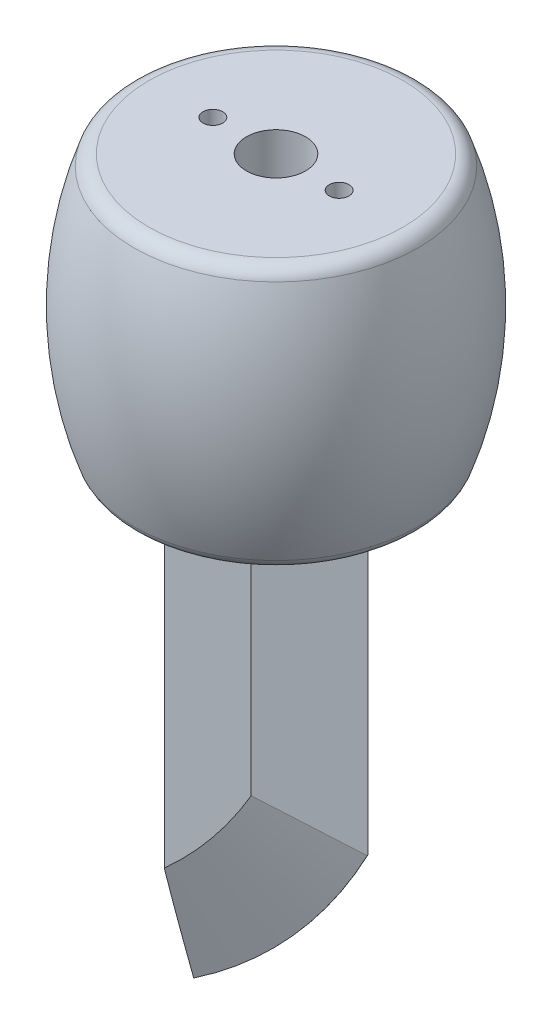
ISO-10303-21;
HEADER;
FILE_DESCRIPTION(('STEP AP214'),'2;1');
FILE_NAME('part.step','',(''),(''),'','','');
FILE_SCHEMA(('AUTOMOTIVE_DESIGN { 1 0 10303 214 1 1 1 1 }'));
ENDSEC;
DATA;
#1=APPLICATION_CONTEXT('core data for automotive mechanical design processes');
#2=APPLICATION_PROTOCOL_DEFINITION('international standard','automotive_design',2000,#1);
#3=PRODUCT_CONTEXT('',#1,'mechanical');
#4=PRODUCT('Part','Part','',(#3));
#5=PRODUCT_RELATED_PRODUCT_CATEGORY('part','',(#4));
#6=PRODUCT_DEFINITION_FORMATION('','',#4);
#7=PRODUCT_DEFINITION_CONTEXT('part definition',#1,'design');
#8=PRODUCT_DEFINITION('design','',#6,#7);
#9=PRODUCT_DEFINITION_SHAPE('','',#8);
#10=(LENGTH_UNIT() NAMED_UNIT(*) SI_UNIT(.MILLI.,.METRE.));
#11=(NAMED_UNIT(*) PLANE_ANGLE_UNIT() SI_UNIT($,.RADIAN.));
#12=(NAMED_UNIT(*) SI_UNIT($,.STERADIAN.) SOLID_ANGLE_UNIT());
#13=UNCERTAINTY_MEASURE_WITH_UNIT(LENGTH_MEASURE(1.E-05),#10,'distance_accuracy_value','');
#14=(GEOMETRIC_REPRESENTATION_CONTEXT(3) GLOBAL_UNCERTAINTY_ASSIGNED_CONTEXT((#13)) GLOBAL_UNIT_ASSIGNED_CONTEXT((#10,
#11,#12)) REPRESENTATION_CONTEXT('',''));
#15=CARTESIAN_POINT('',(0.,0.,0.));
#16=DIRECTION('',(0.,0.,1.));
#17=DIRECTION('',(1.,0.,0.));
#18=AXIS2_PLACEMENT_3D('',#15,#16,#17);
#19=CARTESIAN_POINT('',(180.83032118404,79.2235623394899,0.));
#20=DIRECTION('',(0.,-1.,0.));
#21=DIRECTION('',(1.,0.,0.));
#22=AXIS2_PLACEMENT_3D('',#19,#20,#21);
#23=PLANE('',#22);
#24=DIRECTION('',(0.94667744010841,0.,-0.322182905179321));
#25=VECTOR('',#24,1.);
#26=CARTESIAN_POINT('',(181.60603529775,79.2235623394899,4.7625));
#27=LINE('',#26,#25);
#28=CARTESIAN_POINT('',(181.60603529775,79.2235623394899,4.7625));
#29=VERTEX_POINT('',#28);
#30=CARTESIAN_POINT('',(195.599798579532,79.2235623394899,0.));
#31=VERTEX_POINT('',#30);
#32=EDGE_CURVE('E48',#29,#31,#27,.T.);
#33=ORIENTED_EDGE('',*,*,#32,.T.);
#34=DIRECTION('',(-0.94667744010841,0.,-0.322182905179321));
#35=VECTOR('',#34,1.);
#36=CARTESIAN_POINT('',(195.599798579532,79.2235623394899,0.));
#37=LINE('',#36,#35);
#38=CARTESIAN_POINT('',(181.60603529775,79.2235623394899,-4.7625));
#39=VERTEX_POINT('',#38);
#40=EDGE_CURVE('E106',#31,#39,#37,.T.);
#41=ORIENTED_EDGE('',*,*,#40,.T.);
#42=DIRECTION('',(-1.,0.,0.));
#43=VECTOR('',#42,1.);
#44=CARTESIAN_POINT('',(167.612272015968,79.2235623394899,-4.7625));
#45=LINE('',#44,#43);
#46=CARTESIAN_POINT('',(167.612272015968,79.2235623394899,-4.7625));
#47=VERTEX_POINT('',#46);
#48=EDGE_CURVE('E56',#39,#47,#45,.T.);
#49=ORIENTED_EDGE('',*,*,#48,.T.);
#50=DIRECTION('',(0.,0.,1.));
#51=VECTOR('',#50,1.);
#52=CARTESIAN_POINT('',(167.612272015968,79.2235623394899,-4.7625));
#53=LINE('',#52,#51);
#54=CARTESIAN_POINT('',(167.612272015968,79.2235623394899,4.7625));
#55=VERTEX_POINT('',#54);
#56=EDGE_CURVE('E168',#47,#55,#53,.T.);
#57=ORIENTED_EDGE('',*,*,#56,.T.);
#58=DIRECTION('',(-1.,0.,0.));
#59=VECTOR('',#58,1.);
#60=CARTESIAN_POINT('',(167.612272015968,79.2235623394899,4.7625));
#61=LINE('',#60,#59);
#62=EDGE_CURVE('E107',#29,#55,#61,.T.);
#63=ORIENTED_EDGE('',*,*,#62,.F.);
#64=EDGE_LOOP('',(#33,#41,#49,#57,#63));
#65=FACE_BOUND('',#64,.T.);
#66=CARTESIAN_POINT('',(180.83032118404,79.2235623394899,0.));
#67=DIRECTION('',(0.,1.,0.));
#68=DIRECTION('',(-1.,0.,0.));
#69=AXIS2_PLACEMENT_3D('',#66,#67,#68);
#70=CIRCLE('',#69,20.450072340401);
#71=CARTESIAN_POINT('',(160.380248843639,79.2235623394899,0.));
#72=VERTEX_POINT('',#71);
#73=EDGE_CURVE('E11',#72,#72,#70,.T.);
#74=ORIENTED_EDGE('',*,*,#73,.F.);
#75=EDGE_LOOP('',(#74));
#76=FACE_BOUND('',#75,.T.);
#77=ADVANCED_FACE('F33',(#65,#76),#23,.T.);
#78=CARTESIAN_POINT('',(180.83032118404,81.7635623394899,0.));
#79=DIRECTION('',(0.,1.,0.));
#80=DIRECTION('',(-1.,0.,0.));
#81=AXIS2_PLACEMENT_3D('',#78,#79,#80);
#82=TOROIDAL_SURFACE('',#81,20.450072340401,2.54);
#83=ORIENTED_EDGE('',*,*,#73,.T.);
#84=EDGE_LOOP('',(#83));
#85=FACE_BOUND('',#84,.T.);
#86=CARTESIAN_POINT('',(180.83032118404,80.9274838250168,0.));
#87=DIRECTION('',(0.,1.,0.));
#88=DIRECTION('',(-1.,0.,0.));
#89=AXIS2_PLACEMENT_3D('',#86,#87,#88);
#90=CIRCLE('',#89,22.8485244907756);
#91=CARTESIAN_POINT('',(157.981796693264,80.9274838250168,0.));
#92=VERTEX_POINT('',#91);
#93=EDGE_CURVE('E41',#92,#92,#90,.T.);
#94=ORIENTED_EDGE('',*,*,#93,.F.);
#95=EDGE_LOOP('',(#94));
#96=FACE_BOUND('',#95,.T.);
#97=ADVANCED_FACE('F193',(#85,#96),#82,.T.);
#98=CARTESIAN_POINT('',(180.83032118404,100.343549653628,0.));
#99=DIRECTION('',(0.,1.,0.));
#100=DIRECTION('',(-1.,0.,0.));
#101=AXIS2_PLACEMENT_3D('',#98,#99,#100);
#102=DEGENERATE_TOROIDAL_SURFACE('',#101,32.850197617633,58.985856412963,.F.);
#103=ORIENTED_EDGE('',*,*,#93,.T.);
#104=EDGE_LOOP('',(#103));
#105=FACE_BOUND('',#104,.T.);
#106=CARTESIAN_POINT('',(180.83032118404,119.759615482239,0.));
#107=DIRECTION('',(0.,1.,0.));
#108=DIRECTION('',(-1.,0.,0.));
#109=AXIS2_PLACEMENT_3D('',#106,#107,#108);
#110=CIRCLE('',#109,22.8485244907756);
#111=CARTESIAN_POINT('',(157.981796693264,119.759615482239,0.));
#112=VERTEX_POINT('',#111);
#113=EDGE_CURVE('E184',#112,#112,#110,.T.);
#114=ORIENTED_EDGE('',*,*,#113,.F.);
#115=EDGE_LOOP('',(#114));
#116=FACE_BOUND('',#115,.T.);
#117=ADVANCED_FACE('F190',(#105,#116),#102,.F.);
#118=CARTESIAN_POINT('',(180.83032118404,118.923536967766,0.));
#119=DIRECTION('',(0.,1.,0.));
#120=DIRECTION('',(-1.,0.,0.));
#121=AXIS2_PLACEMENT_3D('',#118,#119,#120);
#122=TOROIDAL_SURFACE('',#121,20.450072340401,2.54);
#123=ORIENTED_EDGE('',*,*,#113,.T.);
#124=EDGE_LOOP('',(#123));
#125=FACE_BOUND('',#124,.T.);
#126=CARTESIAN_POINT('',(180.83032118404,121.463536967766,0.));
#127=DIRECTION('',(0.,1.,0.));
#128=DIRECTION('',(-1.,0.,0.));
#129=AXIS2_PLACEMENT_3D('',#126,#127,#128);
#130=CIRCLE('',#129,20.450072340401);
#131=CARTESIAN_POINT('',(160.380248843639,121.463536967766,0.));
#132=VERTEX_POINT('',#131);
#133=EDGE_CURVE('E181',#132,#132,#130,.T.);
#134=ORIENTED_EDGE('',*,*,#133,.F.);
#135=EDGE_LOOP('',(#134));
#136=FACE_BOUND('',#135,.T.);
#137=ADVANCED_FACE('F200',(#125,#136),#122,.T.);
#138=CARTESIAN_POINT('',(164.95532118404,121.463536967766,0.));
#139=DIRECTION('',(0.,1.,0.));
#140=DIRECTION('',(-1.,0.,0.));
#141=AXIS2_PLACEMENT_3D('',#138,#139,#140);
#142=PLANE('',#141);
#143=CARTESIAN_POINT('',(190.99032118404,121.463536967766,0.));
#144=DIRECTION('',(0.,1.,0.));
#145=DIRECTION('',(-1.,0.,0.));
#146=AXIS2_PLACEMENT_3D('',#143,#144,#145);
#147=CIRCLE('',#146,1.58749999999999);
#148=CARTESIAN_POINT('',(189.40282118404,121.463536967766,0.));
#149=VERTEX_POINT('',#148);
#150=EDGE_CURVE('E250',#149,#149,#147,.T.);
#151=ORIENTED_EDGE('',*,*,#150,.F.);
#152=EDGE_LOOP('',(#151));
#153=FACE_BOUND('',#152,.T.);
#154=CARTESIAN_POINT('',(170.67032118404,121.463536967766,0.));
#155=DIRECTION('',(0.,1.,0.));
#156=DIRECTION('',(-1.,0.,0.));
#157=AXIS2_PLACEMENT_3D('',#154,#155,#156);
#158=CIRCLE('',#157,1.58749999999999);
#159=CARTESIAN_POINT('',(169.08282118404,121.463536967766,0.));
#160=VERTEX_POINT('',#159);
#161=EDGE_CURVE('E151',#160,#160,#158,.T.);
#162=ORIENTED_EDGE('',*,*,#161,.F.);
#163=EDGE_LOOP('',(#162));
#164=FACE_BOUND('',#163,.T.);
#165=ORIENTED_EDGE('',*,*,#133,.T.);
#166=EDGE_LOOP('',(#165));
#167=FACE_BOUND('',#166,.T.);
#168=CARTESIAN_POINT('',(180.83032118404,121.463536967766,0.));
#169=DIRECTION('',(0.,-1.,0.));
#170=DIRECTION('',(0.,0.,-1.));
#171=AXIS2_PLACEMENT_3D('',#168,#169,#170);
#172=CIRCLE('',#171,4.76250000000001);
#173=CARTESIAN_POINT('',(180.83032118404,121.463536967766,-4.76250000000001));
#174=VERTEX_POINT('',#173);
#175=EDGE_CURVE('E36',#174,#174,#172,.F.);
#176=ORIENTED_EDGE('',*,*,#175,.F.);
#177=EDGE_LOOP('',(#176));
#178=FACE_BOUND('',#177,.T.);
#179=ADVANCED_FACE('F205',(#153,#164,#167,#178),#142,.T.);
#180=CARTESIAN_POINT('',(119.528704548027,71.367250197041,-4.7625));
#181=DIRECTION('',(0.,0.,1.));
#182=DIRECTION('',(1.,0.,0.));
#183=AXIS2_PLACEMENT_3D('',#180,#181,#182);
#184=CYLINDRICAL_SURFACE('',#183,86.05413331811);
#185=CARTESIAN_POINT('',(119.528704548027,71.367250197041,-0.0230487278248571));
#186=DIRECTION('',(0.,0.,-1.));
#187=DIRECTION('',(-1.,0.,0.));
#188=AXIS2_PLACEMENT_3D('',#185,#186,#187);
#189=CIRCLE('',#188,86.05413331811);
#190=CARTESIAN_POINT('',(195.532073972472,31.0088347516532,-0.0230487278248597));
#191=VERTEX_POINT('',#190);
#192=CARTESIAN_POINT('',(167.612272015979,-1.66035614954478E-11,-0.0230487278181186));
#193=VERTEX_POINT('',#192);
#194=EDGE_CURVE('E379',#191,#193,#189,.T.);
#195=ORIENTED_EDGE('',*,*,#194,.F.);
#196=CARTESIAN_POINT('',(119.528704548027,71.367250197041,-25.8892892519261));
#197=DIRECTION('',(0.322182905179321,0.,-0.94667744010841));
#198=DIRECTION('',(0.94667744010841,0.,0.322182905179321));
#199=AXIS2_PLACEMENT_3D('',#196,#197,#198);
#200=ELLIPSE('',#199,90.9012190131576,86.05413331811);
#201=CARTESIAN_POINT('',(195.599798579532,31.136633572622,0.));
#202=VERTEX_POINT('',#201);
#203=EDGE_CURVE('E156',#191,#202,#200,.F.);
#204=ORIENTED_EDGE('',*,*,#203,.T.);
#205=CARTESIAN_POINT('',(119.528704548027,71.367250197041,25.8892892519261));
#206=DIRECTION('',(0.322182905179321,0.,0.94667744010841));
#207=DIRECTION('',(-0.94667744010841,0.,0.322182905179321));
#208=AXIS2_PLACEMENT_3D('',#205,#206,#207);
#209=ELLIPSE('',#208,90.9012190131576,86.05413331811);
#210=CARTESIAN_POINT('',(195.532073972472,31.0088347516532,0.0230487278248524));
#211=VERTEX_POINT('',#210);
#212=EDGE_CURVE('E97',#202,#211,#209,.F.);
#213=ORIENTED_EDGE('',*,*,#212,.T.);
#214=CARTESIAN_POINT('',(119.528704548027,71.367250197041,0.0230487278248571));
#215=DIRECTION('',(0.,0.,-1.));
#216=DIRECTION('',(-1.,0.,0.));
#217=AXIS2_PLACEMENT_3D('',#214,#215,#216);
#218=CIRCLE('',#217,86.05413331811);
#219=CARTESIAN_POINT('',(167.612272015968,0.,0.0230487278248493));
#220=VERTEX_POINT('',#219);
#221=EDGE_CURVE('E131',#220,#211,#218,.F.);
#222=ORIENTED_EDGE('',*,*,#221,.F.);
#223=DIRECTION('',(0.,0.,1.));
#224=VECTOR('',#223,1.);
#225=CARTESIAN_POINT('',(167.612272015968,0.,-4.7625));
#226=LINE('',#225,#224);
#227=EDGE_CURVE('E174',#193,#220,#226,.T.);
#228=ORIENTED_EDGE('',*,*,#227,.F.);
#229=EDGE_LOOP('',(#195,#204,#213,#222,#228));
#230=FACE_BOUND('',#229,.T.);
#231=ADVANCED_FACE('F209',(#230),#184,.T.);
#232=CARTESIAN_POINT('',(167.612272015968,79.2235623394899,-4.7625));
#233=DIRECTION('',(-1.,0.,0.));
#234=DIRECTION('',(0.,0.,1.));
#235=AXIS2_PLACEMENT_3D('',#232,#233,#234);
#236=PLANE('',#235);
#237=CARTESIAN_POINT('',(167.612272015968,0.,-0.023048727824859));
#238=CARTESIAN_POINT('',(167.612272015968,0.735041511566373,-0.228469081930001));
#239=CARTESIAN_POINT('',(167.612272015968,1.47030973892283,-0.433079435122302));
#240=CARTESIAN_POINT('',(167.612272015968,2.94133000814649,-0.840553607666766));
#241=CARTESIAN_POINT('',(167.612272015968,3.67708205006022,-1.04341742685089));
#242=CARTESIAN_POINT('',(167.612272015968,5.14910027267577,-1.44727198249762));
#243=CARTESIAN_POINT('',(167.612272015968,5.88536645343539,-1.64826271874958));
#244=CARTESIAN_POINT('',(167.612272015968,7.35844591053276,-2.04823011905868));
#245=CARTESIAN_POINT('',(167.612272015968,8.09525918694256,-2.24720678285058));
#246=CARTESIAN_POINT('',(167.612272015968,9.56946804832132,-2.64299219060918));
#247=CARTESIAN_POINT('',(167.612272015968,10.3068636333802,-2.83980093424097));
#248=CARTESIAN_POINT('',(167.612272015968,11.7822740679159,-3.23108477765463));
#249=CARTESIAN_POINT('',(167.612272015968,12.5202889175051,-3.42555987701293));
#250=CARTESIAN_POINT('',(167.612272015968,14.7357987584653,-4.00532235629713));
#251=CARTESIAN_POINT('',(167.612272015968,16.214285743438,-4.38681959787286));
#252=CARTESIAN_POINT('',(167.612272015968,17.6942617939415,-4.7625));
#253=B_SPLINE_CURVE_WITH_KNOTS('',3,(#237,#238,#239,#240,#241,#242,#243,#244,#245,#246,#247,
#248,#249,#250,#251,#252),.UNSPECIFIED.,.F.,.F.,(4,2,2,2,2,2,2,4),(0.,2.28961831989026,
4.5792368600707,6.8688556577543,9.15847475698481,11.4480942099406,13.7377140784792,
18.3184241538408),.UNSPECIFIED.);
#254=CARTESIAN_POINT('',(167.612272015968,17.6942617939415,-4.76250000000001));
#255=VERTEX_POINT('',#254);
#256=EDGE_CURVE('E160',#193,#255,#253,.T.);
#257=ORIENTED_EDGE('',*,*,#256,.F.);
#258=ORIENTED_EDGE('',*,*,#227,.T.);
#259=CARTESIAN_POINT('',(167.612272015968,17.6942617939415,4.7625));
#260=CARTESIAN_POINT('',(167.612272015968,16.214793416776,4.38694848982877));
#261=CARTESIAN_POINT('',(167.612272015968,14.7368130857553,4.00558409642277));
#262=CARTESIAN_POINT('',(167.612272015968,12.5218291240936,3.42596477282377));
#263=CARTESIAN_POINT('',(167.612272015968,11.7838343471748,3.23149677996961));
#264=CARTESIAN_POINT('',(167.612272015968,10.3084640587215,2.8402271555123));
#265=CARTESIAN_POINT('',(167.612272015968,9.5710885470683,2.64342552435626));
#266=CARTESIAN_POINT('',(167.612272015968,8.09691983320349,2.24765434499988));
#267=CARTESIAN_POINT('',(167.612272015968,7.36012663089694,2.0486847971529));
#268=CARTESIAN_POINT('',(167.612272015968,5.88708732312565,1.64873162892874));
#269=CARTESIAN_POINT('',(167.612272015968,5.15084121758494,1.44774800883127));
#270=CARTESIAN_POINT('',(167.612272015968,3.67855131766373,1.04382213372675));
#271=CARTESIAN_POINT('',(167.612272015968,2.94250774106541,0.840879085163417));
#272=CARTESIAN_POINT('',(167.612272015968,1.47090047527344,0.43324382325182));
#273=CARTESIAN_POINT('',(167.612272015968,0.735336788877236,0.228551599803369));
#274=CARTESIAN_POINT('',(167.612272015968,0.,0.0230487278248558));
#275=B_SPLINE_CURVE_WITH_KNOTS('',3,(#259,#260,#261,#262,#263,#264,#265,#266,#267,#268,#269,
#270,#271,#272,#273,#274),.UNSPECIFIED.,.F.,.F.,(4,2,2,2,2,2,2,4),(0.,4.57913876955457,
6.86869497527049,9.15825074232698,11.4478061361969,13.7373612120997,16.0278860698116,
18.318424162547),.UNSPECIFIED.);
#276=CARTESIAN_POINT('',(167.612272015968,17.6942617939415,4.7625));
#277=VERTEX_POINT('',#276);
#278=EDGE_CURVE('E124',#277,#220,#275,.T.);
#279=ORIENTED_EDGE('',*,*,#278,.F.);
#280=DIRECTION('',(0.,-1.,0.));
#281=VECTOR('',#280,1.);
#282=CARTESIAN_POINT('',(167.612272015968,79.2235623394899,4.7625));
#283=LINE('',#282,#281);
#284=EDGE_CURVE('E166',#55,#277,#283,.T.);
#285=ORIENTED_EDGE('',*,*,#284,.F.);
#286=ORIENTED_EDGE('',*,*,#56,.F.);
#287=DIRECTION('',(0.,-1.,0.));
#288=VECTOR('',#287,1.);
#289=CARTESIAN_POINT('',(167.612272015968,79.2235623394899,-4.7625));
#290=LINE('',#289,#288);
#291=EDGE_CURVE('E165',#47,#255,#290,.T.);
#292=ORIENTED_EDGE('',*,*,#291,.T.);
#293=EDGE_LOOP('',(#257,#258,#279,#285,#286,#292));
#294=FACE_BOUND('',#293,.T.);
#295=ADVANCED_FACE('F133',(#294),#236,.T.);
#296=CARTESIAN_POINT('',(119.528704548027,71.367250197041,-4.7625));
#297=DIRECTION('',(0.,0.,1.));
#298=DIRECTION('',(1.,0.,0.));
#299=AXIS2_PLACEMENT_3D('',#296,#297,#298);
#300=PLANE('',#299);
#301=DIRECTION('',(0.,1.,0.));
#302=VECTOR('',#301,1.);
#303=CARTESIAN_POINT('',(181.60603529775,9.98185815277274,-4.7625));
#304=LINE('',#303,#302);
#305=CARTESIAN_POINT('',(181.60603529775,34.7718385781949,-4.7625));
#306=VERTEX_POINT('',#305);
#307=EDGE_CURVE('E102',#306,#39,#304,.T.);
#308=ORIENTED_EDGE('',*,*,#307,.F.);
#309=CARTESIAN_POINT('',(119.528704548027,71.367250197041,-4.76250000000001));
#310=DIRECTION('',(0.,0.,-1.));
#311=DIRECTION('',(-1.,0.,0.));
#312=AXIS2_PLACEMENT_3D('',#309,#310,#311);
#313=CIRCLE('',#312,72.0612180341358);
#314=EDGE_CURVE('E117',#306,#255,#313,.T.);
#315=ORIENTED_EDGE('',*,*,#314,.T.);
#316=ORIENTED_EDGE('',*,*,#291,.F.);
#317=ORIENTED_EDGE('',*,*,#48,.F.);
#318=EDGE_LOOP('',(#308,#315,#316,#317));
#319=FACE_BOUND('',#318,.T.);
#320=ADVANCED_FACE('F164',(#319),#300,.F.);
#321=CARTESIAN_POINT('',(119.528704548027,71.367250197041,4.7625));
#322=DIRECTION('',(0.,0.,1.));
#323=DIRECTION('',(1.,0.,0.));
#324=AXIS2_PLACEMENT_3D('',#321,#322,#323);
#325=PLANE('',#324);
#326=CARTESIAN_POINT('',(119.528704548027,71.367250197041,4.7625));
#327=DIRECTION('',(0.,0.,-1.));
#328=DIRECTION('',(-1.,0.,0.));
#329=AXIS2_PLACEMENT_3D('',#326,#327,#328);
#330=CIRCLE('',#329,72.0612180341358);
#331=CARTESIAN_POINT('',(181.60603529775,34.7718385781949,4.7625));
#332=VERTEX_POINT('',#331);
#333=EDGE_CURVE('E120',#332,#277,#330,.T.);
#334=ORIENTED_EDGE('',*,*,#333,.F.);
#335=DIRECTION('',(0.,1.,0.));
#336=VECTOR('',#335,1.);
#337=CARTESIAN_POINT('',(181.60603529775,9.98185815277274,4.7625));
#338=LINE('',#337,#336);
#339=EDGE_CURVE('E101',#332,#29,#338,.T.);
#340=ORIENTED_EDGE('',*,*,#339,.T.);
#341=ORIENTED_EDGE('',*,*,#62,.T.);
#342=ORIENTED_EDGE('',*,*,#284,.T.);
#343=EDGE_LOOP('',(#334,#340,#341,#342));
#344=FACE_BOUND('',#343,.T.);
#345=ADVANCED_FACE('F147',(#344),#325,.T.);
#346=DIRECTION('',(-0.917145627834926,0.247825141639417,-0.312132338143107));
#347=VECTOR('',#346,1.);
#348=CARTESIAN_POINT('',(200.374897322769,29.7002384433925,1.62511022279992));
#349=LINE('',#348,#347);
#350=CARTESIAN_POINT('',(119.528704548027,71.367250197041,4.7625));
#351=DIRECTION('',(0.,0.,-1.));
#352=AXIS1_PLACEMENT('',#350,#351);
#353=SURFACE_OF_REVOLUTION('',#349,#352);
#354=ORIENTED_EDGE('',*,*,#194,.T.);
#355=ORIENTED_EDGE('',*,*,#256,.T.);
#356=ORIENTED_EDGE('',*,*,#314,.F.);
#357=EDGE_CURVE('E121',#191,#306,#349,.T.);
#358=ORIENTED_EDGE('',*,*,#357,.F.);
#359=EDGE_LOOP('',(#354,#355,#356,#358));
#360=FACE_BOUND('',#359,.T.);
#361=ADVANCED_FACE('F143',(#360),#353,.T.);
#362=DIRECTION('',(0.917145627834926,-0.247825141639417,-0.312132338143107));
#363=VECTOR('',#362,1.);
#364=CARTESIAN_POINT('',(187.240593210189,33.2493048928717,2.84488988200388));
#365=LINE('',#364,#363);
#366=CARTESIAN_POINT('',(119.528704548027,71.367250197041,4.7625));
#367=DIRECTION('',(0.,0.,-1.));
#368=AXIS1_PLACEMENT('',#366,#367);
#369=SURFACE_OF_REVOLUTION('',#365,#368);
#370=ORIENTED_EDGE('',*,*,#221,.T.);
#371=EDGE_CURVE('E116',#332,#211,#365,.T.);
#372=ORIENTED_EDGE('',*,*,#371,.F.);
#373=ORIENTED_EDGE('',*,*,#333,.T.);
#374=ORIENTED_EDGE('',*,*,#278,.T.);
#375=EDGE_LOOP('',(#370,#372,#373,#374));
#376=FACE_BOUND('',#375,.T.);
#377=ADVANCED_FACE('F137',(#376),#369,.T.);
#378=CARTESIAN_POINT('',(195.599798579532,9.98185815277274,0.));
#379=DIRECTION('',(0.322182905179321,0.,-0.94667744010841));
#380=DIRECTION('',(-0.94667744010841,0.,-0.322182905179321));
#381=AXIS2_PLACEMENT_3D('',#378,#379,#380);
#382=PLANE('',#381);
#383=ORIENTED_EDGE('',*,*,#357,.T.);
#384=ORIENTED_EDGE('',*,*,#307,.T.);
#385=ORIENTED_EDGE('',*,*,#40,.F.);
#386=DIRECTION('',(0.,1.,0.));
#387=VECTOR('',#386,1.);
#388=CARTESIAN_POINT('',(195.599798579532,9.98185815277274,0.));
#389=LINE('',#388,#387);
#390=EDGE_CURVE('E93',#202,#31,#389,.T.);
#391=ORIENTED_EDGE('',*,*,#390,.F.);
#392=ORIENTED_EDGE('',*,*,#203,.F.);
#393=EDGE_LOOP('',(#383,#384,#385,#391,#392));
#394=FACE_BOUND('',#393,.T.);
#395=ADVANCED_FACE('F109',(#394),#382,.T.);
#396=CARTESIAN_POINT('',(181.60603529775,9.98185815277274,4.7625));
#397=DIRECTION('',(0.322182905179321,0.,0.94667744010841));
#398=DIRECTION('',(0.94667744010841,0.,-0.322182905179321));
#399=AXIS2_PLACEMENT_3D('',#396,#397,#398);
#400=PLANE('',#399);
#401=ORIENTED_EDGE('',*,*,#390,.T.);
#402=ORIENTED_EDGE('',*,*,#32,.F.);
#403=ORIENTED_EDGE('',*,*,#339,.F.);
#404=ORIENTED_EDGE('',*,*,#371,.T.);
#405=ORIENTED_EDGE('',*,*,#212,.F.);
#406=EDGE_LOOP('',(#401,#402,#403,#404,#405));
#407=FACE_BOUND('',#406,.T.);
#408=ADVANCED_FACE('F94',(#407),#400,.T.);
#409=CARTESIAN_POINT('',(180.83032118404,106.331995431757,0.));
#410=DIRECTION('',(0.,1.,0.));
#411=DIRECTION('',(-1.,0.,0.));
#412=AXIS2_PLACEMENT_3D('',#409,#410,#411);
#413=PLANE('',#412);
#414=CARTESIAN_POINT('',(180.83032118404,106.331995431757,0.));
#415=DIRECTION('',(0.,1.,0.));
#416=DIRECTION('',(-1.,0.,0.));
#417=AXIS2_PLACEMENT_3D('',#414,#415,#416);
#418=CIRCLE('',#417,4.76250000000001);
#419=CARTESIAN_POINT('',(176.06782118404,106.331995431757,0.));
#420=VERTEX_POINT('',#419);
#421=EDGE_CURVE('E177',#420,#420,#418,.T.);
#422=ORIENTED_EDGE('',*,*,#421,.T.);
#423=EDGE_LOOP('',(#422));
#424=FACE_BOUND('',#423,.T.);
#425=ADVANCED_FACE('F214',(#424),#413,.T.);
#426=CARTESIAN_POINT('',(180.83032118404,106.331995431757,0.));
#427=DIRECTION('',(0.,1.,0.));
#428=DIRECTION('',(-1.,0.,0.));
#429=AXIS2_PLACEMENT_3D('',#426,#427,#428);
#430=CYLINDRICAL_SURFACE('',#429,4.76250000000001);
#431=ORIENTED_EDGE('',*,*,#175,.T.);
#432=EDGE_LOOP('',(#431));
#433=FACE_BOUND('',#432,.T.);
#434=ORIENTED_EDGE('',*,*,#421,.F.);
#435=EDGE_LOOP('',(#434));
#436=FACE_BOUND('',#435,.T.);
#437=ADVANCED_FACE('F211',(#433,#436),#430,.F.);
#438=CARTESIAN_POINT('',(170.67032118404,108.763536967766,0.));
#439=DIRECTION('',(0.,1.,0.));
#440=DIRECTION('',(-1.,0.,0.));
#441=AXIS2_PLACEMENT_3D('',#438,#439,#440);
#442=CYLINDRICAL_SURFACE('',#441,1.58749999999999);
#443=CARTESIAN_POINT('',(170.67032118404,108.763536967766,0.));
#444=DIRECTION('',(0.,1.,0.));
#445=DIRECTION('',(-1.,0.,0.));
#446=AXIS2_PLACEMENT_3D('',#443,#444,#445);
#447=CIRCLE('',#446,1.58749999999999);
#448=CARTESIAN_POINT('',(169.08282118404,108.763536967766,0.));
#449=VERTEX_POINT('',#448);
#450=EDGE_CURVE('E253',#449,#449,#447,.T.);
#451=ORIENTED_EDGE('',*,*,#450,.F.);
#452=EDGE_LOOP('',(#451));
#453=FACE_BOUND('',#452,.T.);
#454=ORIENTED_EDGE('',*,*,#161,.T.);
#455=EDGE_LOOP('',(#454));
#456=FACE_BOUND('',#455,.T.);
#457=ADVANCED_FACE('F213',(#453,#456),#442,.F.);
#458=CARTESIAN_POINT('',(170.67032118404,108.763536967766,0.));
#459=DIRECTION('',(0.,1.,0.));
#460=DIRECTION('',(-1.,0.,0.));
#461=AXIS2_PLACEMENT_3D('',#458,#459,#460);
#462=PLANE('',#461);
#463=ORIENTED_EDGE('',*,*,#450,.T.);
#464=EDGE_LOOP('',(#463));
#465=FACE_BOUND('',#464,.T.);
#466=ADVANCED_FACE('F233',(#465),#462,.T.);
#467=CARTESIAN_POINT('',(190.99032118404,108.763536967766,0.));
#468=DIRECTION('',(0.,1.,0.));
#469=DIRECTION('',(-1.,0.,0.));
#470=AXIS2_PLACEMENT_3D('',#467,#468,#469);
#471=CYLINDRICAL_SURFACE('',#470,1.58749999999999);
#472=CARTESIAN_POINT('',(190.99032118404,108.763536967766,0.));
#473=DIRECTION('',(0.,1.,0.));
#474=DIRECTION('',(-1.,0.,0.));
#475=AXIS2_PLACEMENT_3D('',#472,#473,#474);
#476=CIRCLE('',#475,1.58749999999999);
#477=CARTESIAN_POINT('',(189.40282118404,108.763536967766,0.));
#478=VERTEX_POINT('',#477);
#479=EDGE_CURVE('E249',#478,#478,#476,.T.);
#480=ORIENTED_EDGE('',*,*,#479,.F.);
#481=EDGE_LOOP('',(#480));
#482=FACE_BOUND('',#481,.T.);
#483=ORIENTED_EDGE('',*,*,#150,.T.);
#484=EDGE_LOOP('',(#483));
#485=FACE_BOUND('',#484,.T.);
#486=ADVANCED_FACE('F237',(#482,#485),#471,.F.);
#487=CARTESIAN_POINT('',(190.99032118404,108.763536967766,0.));
#488=DIRECTION('',(0.,1.,0.));
#489=DIRECTION('',(-1.,0.,0.));
#490=AXIS2_PLACEMENT_3D('',#487,#488,#489);
#491=PLANE('',#490);
#492=ORIENTED_EDGE('',*,*,#479,.T.);
#493=EDGE_LOOP('',(#492));
#494=FACE_BOUND('',#493,.T.);
#495=ADVANCED_FACE('F241',(#494),#491,.T.);
#496=CLOSED_SHELL('',(#77,#97,#117,#137,#179,#231,#295,#320,#345,#361,#377,#395,#408,#425,#437,
#457,#466,#486,#495));
#497=MANIFOLD_SOLID_BREP('B2',#496);
#498=ADVANCED_BREP_SHAPE_REPRESENTATION('',(#18,#497),#14);
#499=SHAPE_DEFINITION_REPRESENTATION(#9,#498);
ENDSEC;
END-ISO-10303-21;
